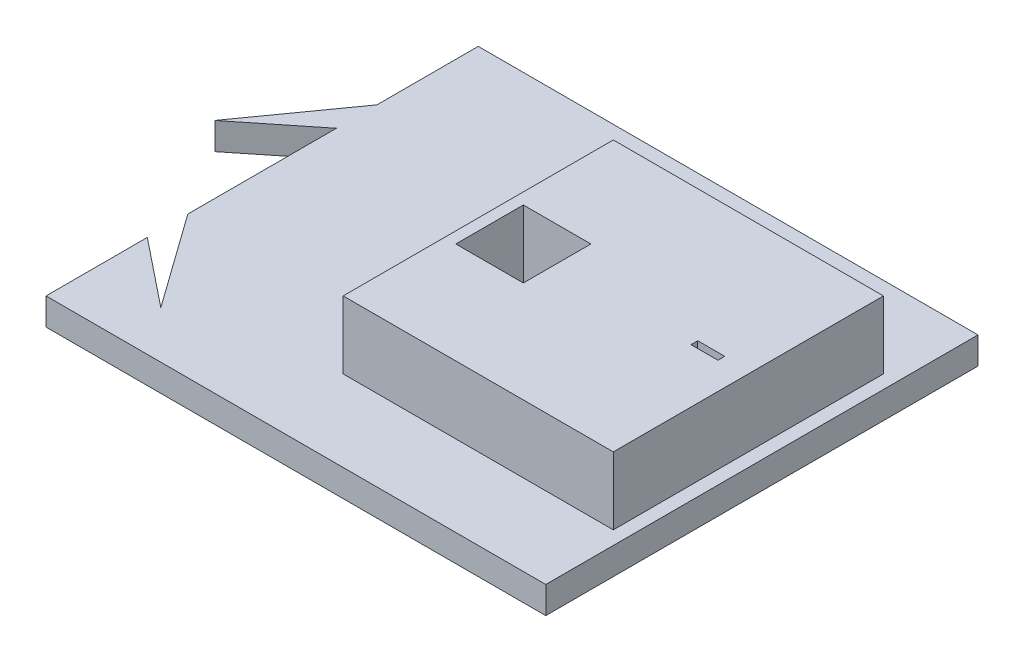
ISO-10303-21;
HEADER;
FILE_DESCRIPTION(('STEP AP214'),'2;1');
FILE_NAME('part.step','',(''),(''),'','','');
FILE_SCHEMA(('AUTOMOTIVE_DESIGN { 1 0 10303 214 1 1 1 1 }'));
ENDSEC;
DATA;
#1=APPLICATION_CONTEXT('core data for automotive mechanical design processes');
#2=APPLICATION_PROTOCOL_DEFINITION('international standard','automotive_design',2000,#1);
#3=PRODUCT_CONTEXT('',#1,'mechanical');
#4=PRODUCT('Part','Part','',(#3));
#5=PRODUCT_RELATED_PRODUCT_CATEGORY('part','',(#4));
#6=PRODUCT_DEFINITION_FORMATION('','',#4);
#7=PRODUCT_DEFINITION_CONTEXT('part definition',#1,'design');
#8=PRODUCT_DEFINITION('design','',#6,#7);
#9=PRODUCT_DEFINITION_SHAPE('','',#8);
#10=(LENGTH_UNIT() NAMED_UNIT(*) SI_UNIT(.MILLI.,.METRE.));
#11=(NAMED_UNIT(*) PLANE_ANGLE_UNIT() SI_UNIT($,.RADIAN.));
#12=(NAMED_UNIT(*) SI_UNIT($,.STERADIAN.) SOLID_ANGLE_UNIT());
#13=UNCERTAINTY_MEASURE_WITH_UNIT(LENGTH_MEASURE(1.E-05),#10,'distance_accuracy_value','');
#14=(GEOMETRIC_REPRESENTATION_CONTEXT(3) GLOBAL_UNCERTAINTY_ASSIGNED_CONTEXT((#13)) GLOBAL_UNIT_ASSIGNED_CONTEXT((#10,
#11,#12)) REPRESENTATION_CONTEXT('',''));
#15=CARTESIAN_POINT('',(0.,0.,0.));
#16=DIRECTION('',(0.,0.,1.));
#17=DIRECTION('',(1.,0.,0.));
#18=AXIS2_PLACEMENT_3D('',#15,#16,#17);
#19=CARTESIAN_POINT('',(0.,20.,0.));
#20=DIRECTION('',(0.,-1.,0.));
#21=DIRECTION('',(0.,0.,-1.));
#22=AXIS2_PLACEMENT_3D('',#19,#20,#21);
#23=PLANE('',#22);
#24=DIRECTION('',(0.,0.,1.));
#25=VECTOR('',#24,1.);
#26=CARTESIAN_POINT('',(0.,20.,0.));
#27=LINE('',#26,#25);
#28=CARTESIAN_POINT('',(0.,20.,-75.));
#29=VERTEX_POINT('',#28);
#30=CARTESIAN_POINT('',(0.,20.,0.));
#31=VERTEX_POINT('',#30);
#32=EDGE_CURVE('E274',#29,#31,#27,.T.);
#33=ORIENTED_EDGE('',*,*,#32,.T.);
#34=DIRECTION('',(1.,0.,0.));
#35=VECTOR('',#34,1.);
#36=CARTESIAN_POINT('',(0.,20.,0.));
#37=LINE('',#36,#35);
#38=CARTESIAN_POINT('',(370.,20.,0.));
#39=VERTEX_POINT('',#38);
#40=EDGE_CURVE('E277',#31,#39,#37,.T.);
#41=ORIENTED_EDGE('',*,*,#40,.T.);
#42=DIRECTION('',(0.,0.,-1.));
#43=VECTOR('',#42,1.);
#44=CARTESIAN_POINT('',(370.,20.,0.));
#45=LINE('',#44,#43);
#46=CARTESIAN_POINT('',(370.,20.,-320.));
#47=VERTEX_POINT('',#46);
#48=EDGE_CURVE('E280',#39,#47,#45,.T.);
#49=ORIENTED_EDGE('',*,*,#48,.T.);
#50=DIRECTION('',(-1.,0.,0.));
#51=VECTOR('',#50,1.);
#52=CARTESIAN_POINT('',(0.,20.,-320.));
#53=LINE('',#52,#51);
#54=CARTESIAN_POINT('',(0.,20.,-320.));
#55=VERTEX_POINT('',#54);
#56=EDGE_CURVE('E282',#47,#55,#53,.T.);
#57=ORIENTED_EDGE('',*,*,#56,.T.);
#58=DIRECTION('',(0.,0.,1.));
#59=VECTOR('',#58,1.);
#60=CARTESIAN_POINT('',(0.,20.,-245.));
#61=LINE('',#60,#59);
#62=CARTESIAN_POINT('',(0.,20.,-245.));
#63=VERTEX_POINT('',#62);
#64=EDGE_CURVE('E284',#55,#63,#61,.T.);
#65=ORIENTED_EDGE('',*,*,#64,.T.);
#66=DIRECTION('',(-0.581238193719096,0.,0.813733471206735));
#67=VECTOR('',#66,1.);
#68=CARTESIAN_POINT('',(-50.,20.,-175.));
#69=LINE('',#68,#67);
#70=CARTESIAN_POINT('',(-50.,20.,-175.));
#71=VERTEX_POINT('',#70);
#72=EDGE_CURVE('E286',#63,#71,#69,.T.);
#73=ORIENTED_EDGE('',*,*,#72,.T.);
#74=DIRECTION('',(0.78086880944303,0.,-0.624695047554424));
#75=VECTOR('',#74,1.);
#76=CARTESIAN_POINT('',(0.,20.,-215.));
#77=LINE('',#76,#75);
#78=CARTESIAN_POINT('',(0.,20.,-215.));
#79=VERTEX_POINT('',#78);
#80=EDGE_CURVE('E288',#71,#79,#77,.T.);
#81=ORIENTED_EDGE('',*,*,#80,.T.);
#82=DIRECTION('',(0.,0.,1.));
#83=VECTOR('',#82,1.);
#84=CARTESIAN_POINT('',(0.,20.,-105.));
#85=LINE('',#84,#83);
#86=CARTESIAN_POINT('',(0.,20.,-105.));
#87=VERTEX_POINT('',#86);
#88=EDGE_CURVE('E290',#79,#87,#85,.T.);
#89=ORIENTED_EDGE('',*,*,#88,.T.);
#90=DIRECTION('',(0.581238193719096,0.,0.813733471206735));
#91=VECTOR('',#90,1.);
#92=CARTESIAN_POINT('',(50.,20.,-35.));
#93=LINE('',#92,#91);
#94=CARTESIAN_POINT('',(50.,20.,-35.));
#95=VERTEX_POINT('',#94);
#96=EDGE_CURVE('E292',#87,#95,#93,.T.);
#97=ORIENTED_EDGE('',*,*,#96,.T.);
#98=DIRECTION('',(-0.78086880944303,0.,-0.624695047554424));
#99=VECTOR('',#98,1.);
#100=CARTESIAN_POINT('',(0.,20.,-75.));
#101=LINE('',#100,#99);
#102=EDGE_CURVE('E294',#95,#29,#101,.T.);
#103=ORIENTED_EDGE('',*,*,#102,.T.);
#104=EDGE_LOOP('',(#33,#41,#49,#57,#65,#73,#81,#89,#97,#103));
#105=FACE_BOUND('',#104,.T.);
#106=DIRECTION('',(0.,0.,-1.));
#107=VECTOR('',#106,1.);
#108=CARTESIAN_POINT('',(360.,20.,-60.));
#109=LINE('',#108,#107);
#110=CARTESIAN_POINT('',(360.,20.,-60.));
#111=VERTEX_POINT('',#110);
#112=CARTESIAN_POINT('',(360.,20.,-260.));
#113=VERTEX_POINT('',#112);
#114=EDGE_CURVE('E56',#111,#113,#109,.T.);
#115=ORIENTED_EDGE('',*,*,#114,.F.);
#116=DIRECTION('',(1.,0.,0.));
#117=VECTOR('',#116,1.);
#118=CARTESIAN_POINT('',(360.,20.,-60.));
#119=LINE('',#118,#117);
#120=CARTESIAN_POINT('',(160.,20.,-60.));
#121=VERTEX_POINT('',#120);
#122=EDGE_CURVE('E243',#121,#111,#119,.T.);
#123=ORIENTED_EDGE('',*,*,#122,.F.);
#124=DIRECTION('',(0.,0.,1.));
#125=VECTOR('',#124,1.);
#126=CARTESIAN_POINT('',(160.,20.,-60.));
#127=LINE('',#126,#125);
#128=CARTESIAN_POINT('',(160.,20.,-260.));
#129=VERTEX_POINT('',#128);
#130=EDGE_CURVE('E254',#129,#121,#127,.T.);
#131=ORIENTED_EDGE('',*,*,#130,.F.);
#132=DIRECTION('',(-1.,0.,0.));
#133=VECTOR('',#132,1.);
#134=CARTESIAN_POINT('',(360.,20.,-260.));
#135=LINE('',#134,#133);
#136=EDGE_CURVE('E251',#113,#129,#135,.T.);
#137=ORIENTED_EDGE('',*,*,#136,.F.);
#138=EDGE_LOOP('',(#115,#123,#131,#137));
#139=FACE_BOUND('',#138,.T.);
#140=ADVANCED_FACE('F33',(#105,#139),#23,.F.);
#141=CARTESIAN_POINT('',(0.,20.,0.));
#142=DIRECTION('',(1.,0.,0.));
#143=DIRECTION('',(0.,0.,-1.));
#144=AXIS2_PLACEMENT_3D('',#141,#142,#143);
#145=PLANE('',#144);
#146=DIRECTION('',(0.,0.,1.));
#147=VECTOR('',#146,1.);
#148=CARTESIAN_POINT('',(0.,0.,0.));
#149=LINE('',#148,#147);
#150=CARTESIAN_POINT('',(0.,0.,-75.));
#151=VERTEX_POINT('',#150);
#152=CARTESIAN_POINT('',(0.,0.,0.));
#153=VERTEX_POINT('',#152);
#154=EDGE_CURVE('E270',#151,#153,#149,.T.);
#155=ORIENTED_EDGE('',*,*,#154,.T.);
#156=DIRECTION('',(0.,-1.,0.));
#157=VECTOR('',#156,1.);
#158=CARTESIAN_POINT('',(0.,20.,0.));
#159=LINE('',#158,#157);
#160=EDGE_CURVE('E342',#31,#153,#159,.T.);
#161=ORIENTED_EDGE('',*,*,#160,.F.);
#162=ORIENTED_EDGE('',*,*,#32,.F.);
#163=DIRECTION('',(0.,-1.,0.));
#164=VECTOR('',#163,1.);
#165=CARTESIAN_POINT('',(0.,20.,-75.));
#166=LINE('',#165,#164);
#167=EDGE_CURVE('E296',#29,#151,#166,.T.);
#168=ORIENTED_EDGE('',*,*,#167,.T.);
#169=EDGE_LOOP('',(#155,#161,#162,#168));
#170=FACE_BOUND('',#169,.T.);
#171=ADVANCED_FACE('F35',(#170),#145,.F.);
#172=CARTESIAN_POINT('',(0.,20.,0.));
#173=DIRECTION('',(0.,0.,-1.));
#174=DIRECTION('',(-1.,0.,0.));
#175=AXIS2_PLACEMENT_3D('',#172,#173,#174);
#176=PLANE('',#175);
#177=DIRECTION('',(1.,0.,0.));
#178=VECTOR('',#177,1.);
#179=CARTESIAN_POINT('',(0.,0.,0.));
#180=LINE('',#179,#178);
#181=CARTESIAN_POINT('',(370.,0.,0.));
#182=VERTEX_POINT('',#181);
#183=EDGE_CURVE('E299',#153,#182,#180,.T.);
#184=ORIENTED_EDGE('',*,*,#183,.T.);
#185=DIRECTION('',(0.,-1.,0.));
#186=VECTOR('',#185,1.);
#187=CARTESIAN_POINT('',(370.,20.,0.));
#188=LINE('',#187,#186);
#189=EDGE_CURVE('E339',#39,#182,#188,.T.);
#190=ORIENTED_EDGE('',*,*,#189,.F.);
#191=ORIENTED_EDGE('',*,*,#40,.F.);
#192=ORIENTED_EDGE('',*,*,#160,.T.);
#193=EDGE_LOOP('',(#184,#190,#191,#192));
#194=FACE_BOUND('',#193,.T.);
#195=ADVANCED_FACE('F375',(#194),#176,.F.);
#196=CARTESIAN_POINT('',(370.,20.,0.));
#197=DIRECTION('',(-1.,0.,0.));
#198=DIRECTION('',(0.,0.,1.));
#199=AXIS2_PLACEMENT_3D('',#196,#197,#198);
#200=PLANE('',#199);
#201=DIRECTION('',(0.,0.,-1.));
#202=VECTOR('',#201,1.);
#203=CARTESIAN_POINT('',(370.,0.,0.));
#204=LINE('',#203,#202);
#205=CARTESIAN_POINT('',(370.,0.,-320.));
#206=VERTEX_POINT('',#205);
#207=EDGE_CURVE('E301',#182,#206,#204,.T.);
#208=ORIENTED_EDGE('',*,*,#207,.T.);
#209=DIRECTION('',(0.,-1.,0.));
#210=VECTOR('',#209,1.);
#211=CARTESIAN_POINT('',(370.,20.,-320.));
#212=LINE('',#211,#210);
#213=EDGE_CURVE('E336',#47,#206,#212,.T.);
#214=ORIENTED_EDGE('',*,*,#213,.F.);
#215=ORIENTED_EDGE('',*,*,#48,.F.);
#216=ORIENTED_EDGE('',*,*,#189,.T.);
#217=EDGE_LOOP('',(#208,#214,#215,#216));
#218=FACE_BOUND('',#217,.T.);
#219=ADVANCED_FACE('F462',(#218),#200,.F.);
#220=CARTESIAN_POINT('',(0.,20.,-320.));
#221=DIRECTION('',(0.,0.,1.));
#222=DIRECTION('',(1.,0.,0.));
#223=AXIS2_PLACEMENT_3D('',#220,#221,#222);
#224=PLANE('',#223);
#225=DIRECTION('',(-1.,0.,0.));
#226=VECTOR('',#225,1.);
#227=CARTESIAN_POINT('',(0.,0.,-320.));
#228=LINE('',#227,#226);
#229=CARTESIAN_POINT('',(0.,0.,-320.));
#230=VERTEX_POINT('',#229);
#231=EDGE_CURVE('E303',#206,#230,#228,.T.);
#232=ORIENTED_EDGE('',*,*,#231,.T.);
#233=DIRECTION('',(0.,-1.,0.));
#234=VECTOR('',#233,1.);
#235=CARTESIAN_POINT('',(0.,20.,-320.));
#236=LINE('',#235,#234);
#237=EDGE_CURVE('E333',#55,#230,#236,.T.);
#238=ORIENTED_EDGE('',*,*,#237,.F.);
#239=ORIENTED_EDGE('',*,*,#56,.F.);
#240=ORIENTED_EDGE('',*,*,#213,.T.);
#241=EDGE_LOOP('',(#232,#238,#239,#240));
#242=FACE_BOUND('',#241,.T.);
#243=ADVANCED_FACE('F458',(#242),#224,.F.);
#244=CARTESIAN_POINT('',(0.,20.,-245.));
#245=DIRECTION('',(1.,0.,0.));
#246=DIRECTION('',(0.,0.,-1.));
#247=AXIS2_PLACEMENT_3D('',#244,#245,#246);
#248=PLANE('',#247);
#249=DIRECTION('',(0.,0.,1.));
#250=VECTOR('',#249,1.);
#251=CARTESIAN_POINT('',(0.,0.,-245.));
#252=LINE('',#251,#250);
#253=CARTESIAN_POINT('',(0.,0.,-245.));
#254=VERTEX_POINT('',#253);
#255=EDGE_CURVE('E305',#230,#254,#252,.T.);
#256=ORIENTED_EDGE('',*,*,#255,.T.);
#257=DIRECTION('',(0.,-1.,0.));
#258=VECTOR('',#257,1.);
#259=CARTESIAN_POINT('',(0.,20.,-245.));
#260=LINE('',#259,#258);
#261=EDGE_CURVE('E330',#63,#254,#260,.T.);
#262=ORIENTED_EDGE('',*,*,#261,.F.);
#263=ORIENTED_EDGE('',*,*,#64,.F.);
#264=ORIENTED_EDGE('',*,*,#237,.T.);
#265=EDGE_LOOP('',(#256,#262,#263,#264));
#266=FACE_BOUND('',#265,.T.);
#267=ADVANCED_FACE('F454',(#266),#248,.F.);
#268=CARTESIAN_POINT('',(-50.,20.,-175.));
#269=DIRECTION('',(0.813733471206735,0.,0.581238193719096));
#270=DIRECTION('',(0.581238193719096,0.,-0.813733471206735));
#271=AXIS2_PLACEMENT_3D('',#268,#269,#270);
#272=PLANE('',#271);
#273=DIRECTION('',(-0.581238193719096,0.,0.813733471206735));
#274=VECTOR('',#273,1.);
#275=CARTESIAN_POINT('',(-50.,0.,-175.));
#276=LINE('',#275,#274);
#277=CARTESIAN_POINT('',(-50.,0.,-175.));
#278=VERTEX_POINT('',#277);
#279=EDGE_CURVE('E307',#254,#278,#276,.T.);
#280=ORIENTED_EDGE('',*,*,#279,.T.);
#281=DIRECTION('',(0.,-1.,0.));
#282=VECTOR('',#281,1.);
#283=CARTESIAN_POINT('',(-50.,20.,-175.));
#284=LINE('',#283,#282);
#285=EDGE_CURVE('E327',#71,#278,#284,.T.);
#286=ORIENTED_EDGE('',*,*,#285,.F.);
#287=ORIENTED_EDGE('',*,*,#72,.F.);
#288=ORIENTED_EDGE('',*,*,#261,.T.);
#289=EDGE_LOOP('',(#280,#286,#287,#288));
#290=FACE_BOUND('',#289,.T.);
#291=ADVANCED_FACE('F450',(#290),#272,.F.);
#292=CARTESIAN_POINT('',(0.,20.,-215.));
#293=DIRECTION('',(-0.624695047554424,0.,-0.78086880944303));
#294=DIRECTION('',(-0.78086880944303,0.,0.624695047554424));
#295=AXIS2_PLACEMENT_3D('',#292,#293,#294);
#296=PLANE('',#295);
#297=DIRECTION('',(0.78086880944303,0.,-0.624695047554424));
#298=VECTOR('',#297,1.);
#299=CARTESIAN_POINT('',(0.,0.,-215.));
#300=LINE('',#299,#298);
#301=CARTESIAN_POINT('',(0.,0.,-215.));
#302=VERTEX_POINT('',#301);
#303=EDGE_CURVE('E309',#278,#302,#300,.T.);
#304=ORIENTED_EDGE('',*,*,#303,.T.);
#305=DIRECTION('',(0.,-1.,0.));
#306=VECTOR('',#305,1.);
#307=CARTESIAN_POINT('',(0.,20.,-215.));
#308=LINE('',#307,#306);
#309=EDGE_CURVE('E324',#79,#302,#308,.T.);
#310=ORIENTED_EDGE('',*,*,#309,.F.);
#311=ORIENTED_EDGE('',*,*,#80,.F.);
#312=ORIENTED_EDGE('',*,*,#285,.T.);
#313=EDGE_LOOP('',(#304,#310,#311,#312));
#314=FACE_BOUND('',#313,.T.);
#315=ADVANCED_FACE('F446',(#314),#296,.F.);
#316=CARTESIAN_POINT('',(0.,20.,-105.));
#317=DIRECTION('',(1.,0.,0.));
#318=DIRECTION('',(0.,0.,-1.));
#319=AXIS2_PLACEMENT_3D('',#316,#317,#318);
#320=PLANE('',#319);
#321=DIRECTION('',(0.,0.,1.));
#322=VECTOR('',#321,1.);
#323=CARTESIAN_POINT('',(0.,0.,-105.));
#324=LINE('',#323,#322);
#325=CARTESIAN_POINT('',(0.,0.,-105.));
#326=VERTEX_POINT('',#325);
#327=EDGE_CURVE('E311',#302,#326,#324,.T.);
#328=ORIENTED_EDGE('',*,*,#327,.T.);
#329=DIRECTION('',(0.,-1.,0.));
#330=VECTOR('',#329,1.);
#331=CARTESIAN_POINT('',(0.,20.,-105.));
#332=LINE('',#331,#330);
#333=EDGE_CURVE('E321',#87,#326,#332,.T.);
#334=ORIENTED_EDGE('',*,*,#333,.F.);
#335=ORIENTED_EDGE('',*,*,#88,.F.);
#336=ORIENTED_EDGE('',*,*,#309,.T.);
#337=EDGE_LOOP('',(#328,#334,#335,#336));
#338=FACE_BOUND('',#337,.T.);
#339=ADVANCED_FACE('F442',(#338),#320,.F.);
#340=CARTESIAN_POINT('',(50.,20.,-35.));
#341=DIRECTION('',(0.813733471206735,0.,-0.581238193719096));
#342=DIRECTION('',(-0.581238193719096,0.,-0.813733471206735));
#343=AXIS2_PLACEMENT_3D('',#340,#341,#342);
#344=PLANE('',#343);
#345=DIRECTION('',(0.581238193719096,0.,0.813733471206735));
#346=VECTOR('',#345,1.);
#347=CARTESIAN_POINT('',(50.,0.,-35.));
#348=LINE('',#347,#346);
#349=CARTESIAN_POINT('',(50.,0.,-35.));
#350=VERTEX_POINT('',#349);
#351=EDGE_CURVE('E313',#326,#350,#348,.T.);
#352=ORIENTED_EDGE('',*,*,#351,.T.);
#353=DIRECTION('',(0.,-1.,0.));
#354=VECTOR('',#353,1.);
#355=CARTESIAN_POINT('',(50.,20.,-35.));
#356=LINE('',#355,#354);
#357=EDGE_CURVE('E318',#95,#350,#356,.T.);
#358=ORIENTED_EDGE('',*,*,#357,.F.);
#359=ORIENTED_EDGE('',*,*,#96,.F.);
#360=ORIENTED_EDGE('',*,*,#333,.T.);
#361=EDGE_LOOP('',(#352,#358,#359,#360));
#362=FACE_BOUND('',#361,.T.);
#363=ADVANCED_FACE('F436',(#362),#344,.F.);
#364=CARTESIAN_POINT('',(0.,20.,-75.));
#365=DIRECTION('',(-0.624695047554424,0.,0.78086880944303));
#366=DIRECTION('',(0.78086880944303,0.,0.624695047554424));
#367=AXIS2_PLACEMENT_3D('',#364,#365,#366);
#368=PLANE('',#367);
#369=DIRECTION('',(-0.78086880944303,0.,-0.624695047554424));
#370=VECTOR('',#369,1.);
#371=CARTESIAN_POINT('',(0.,0.,-75.));
#372=LINE('',#371,#370);
#373=EDGE_CURVE('E278',#350,#151,#372,.T.);
#374=ORIENTED_EDGE('',*,*,#373,.T.);
#375=ORIENTED_EDGE('',*,*,#167,.F.);
#376=ORIENTED_EDGE('',*,*,#102,.F.);
#377=ORIENTED_EDGE('',*,*,#357,.T.);
#378=EDGE_LOOP('',(#374,#375,#376,#377));
#379=FACE_BOUND('',#378,.T.);
#380=ADVANCED_FACE('F432',(#379),#368,.F.);
#381=CARTESIAN_POINT('',(0.,0.,0.));
#382=DIRECTION('',(0.,-1.,0.));
#383=DIRECTION('',(0.,0.,-1.));
#384=AXIS2_PLACEMENT_3D('',#381,#382,#383);
#385=PLANE('',#384);
#386=DIRECTION('',(0.,0.,1.));
#387=VECTOR('',#386,1.);
#388=CARTESIAN_POINT('',(340.,0.,0.));
#389=LINE('',#388,#387);
#390=CARTESIAN_POINT('',(340.,0.,-162.5));
#391=VERTEX_POINT('',#390);
#392=CARTESIAN_POINT('',(340.,0.,-157.5));
#393=VERTEX_POINT('',#392);
#394=EDGE_CURVE('E11',#391,#393,#389,.T.);
#395=ORIENTED_EDGE('',*,*,#394,.F.);
#396=DIRECTION('',(1.,0.,0.));
#397=VECTOR('',#396,1.);
#398=CARTESIAN_POINT('',(-2.25514051876984E-13,0.,-162.5));
#399=LINE('',#398,#397);
#400=CARTESIAN_POINT('',(320.,0.,-162.5));
#401=VERTEX_POINT('',#400);
#402=EDGE_CURVE('E41',#401,#391,#399,.T.);
#403=ORIENTED_EDGE('',*,*,#402,.F.);
#404=DIRECTION('',(0.,0.,-1.));
#405=VECTOR('',#404,1.);
#406=CARTESIAN_POINT('',(320.,0.,0.));
#407=LINE('',#406,#405);
#408=CARTESIAN_POINT('',(320.,0.,-157.5));
#409=VERTEX_POINT('',#408);
#410=EDGE_CURVE('E190',#409,#401,#407,.T.);
#411=ORIENTED_EDGE('',*,*,#410,.F.);
#412=DIRECTION('',(-1.,0.,0.));
#413=VECTOR('',#412,1.);
#414=CARTESIAN_POINT('',(0.,0.,-157.5));
#415=LINE('',#414,#413);
#416=EDGE_CURVE('E345',#393,#409,#415,.T.);
#417=ORIENTED_EDGE('',*,*,#416,.F.);
#418=EDGE_LOOP('',(#395,#403,#411,#417));
#419=FACE_BOUND('',#418,.T.);
#420=ORIENTED_EDGE('',*,*,#154,.F.);
#421=ORIENTED_EDGE('',*,*,#373,.F.);
#422=ORIENTED_EDGE('',*,*,#351,.F.);
#423=ORIENTED_EDGE('',*,*,#327,.F.);
#424=ORIENTED_EDGE('',*,*,#303,.F.);
#425=ORIENTED_EDGE('',*,*,#279,.F.);
#426=ORIENTED_EDGE('',*,*,#255,.F.);
#427=ORIENTED_EDGE('',*,*,#231,.F.);
#428=ORIENTED_EDGE('',*,*,#207,.F.);
#429=ORIENTED_EDGE('',*,*,#183,.F.);
#430=EDGE_LOOP('',(#420,#421,#422,#423,#424,#425,#426,#427,#428,#429));
#431=FACE_BOUND('',#430,.T.);
#432=ADVANCED_FACE('F352',(#419,#431),#385,.T.);
#433=CARTESIAN_POINT('',(340.,20.,-162.5));
#434=DIRECTION('',(1.,0.,0.));
#435=DIRECTION('',(0.,0.,-1.));
#436=AXIS2_PLACEMENT_3D('',#433,#434,#435);
#437=PLANE('',#436);
#438=ORIENTED_EDGE('',*,*,#394,.T.);
#439=DIRECTION('',(0.,-1.,0.));
#440=VECTOR('',#439,1.);
#441=CARTESIAN_POINT('',(340.,20.,-157.5));
#442=LINE('',#441,#440);
#443=CARTESIAN_POINT('',(340.,70.,-157.5));
#444=VERTEX_POINT('',#443);
#445=EDGE_CURVE('E269',#444,#393,#442,.T.);
#446=ORIENTED_EDGE('',*,*,#445,.F.);
#447=DIRECTION('',(0.,0.,1.));
#448=VECTOR('',#447,1.);
#449=CARTESIAN_POINT('',(340.,70.,-157.5));
#450=LINE('',#449,#448);
#451=CARTESIAN_POINT('',(340.,70.,-162.5));
#452=VERTEX_POINT('',#451);
#453=EDGE_CURVE('E199',#452,#444,#450,.T.);
#454=ORIENTED_EDGE('',*,*,#453,.F.);
#455=DIRECTION('',(0.,-1.,0.));
#456=VECTOR('',#455,1.);
#457=CARTESIAN_POINT('',(340.,20.,-162.5));
#458=LINE('',#457,#456);
#459=EDGE_CURVE('E48',#452,#391,#458,.T.);
#460=ORIENTED_EDGE('',*,*,#459,.T.);
#461=EDGE_LOOP('',(#438,#446,#454,#460));
#462=FACE_BOUND('',#461,.T.);
#463=ADVANCED_FACE('F350',(#462),#437,.F.);
#464=CARTESIAN_POINT('',(340.,20.,-162.5));
#465=DIRECTION('',(0.,0.,-1.));
#466=DIRECTION('',(-1.,0.,0.));
#467=AXIS2_PLACEMENT_3D('',#464,#465,#466);
#468=PLANE('',#467);
#469=ORIENTED_EDGE('',*,*,#402,.T.);
#470=ORIENTED_EDGE('',*,*,#459,.F.);
#471=DIRECTION('',(1.,0.,0.));
#472=VECTOR('',#471,1.);
#473=CARTESIAN_POINT('',(320.,70.,-162.5));
#474=LINE('',#473,#472);
#475=CARTESIAN_POINT('',(320.,70.,-162.5));
#476=VERTEX_POINT('',#475);
#477=EDGE_CURVE('E195',#476,#452,#474,.T.);
#478=ORIENTED_EDGE('',*,*,#477,.F.);
#479=DIRECTION('',(0.,-1.,0.));
#480=VECTOR('',#479,1.);
#481=CARTESIAN_POINT('',(320.,20.,-162.5));
#482=LINE('',#481,#480);
#483=EDGE_CURVE('E183',#476,#401,#482,.T.);
#484=ORIENTED_EDGE('',*,*,#483,.T.);
#485=EDGE_LOOP('',(#469,#470,#478,#484));
#486=FACE_BOUND('',#485,.T.);
#487=ADVANCED_FACE('F196',(#486),#468,.F.);
#488=CARTESIAN_POINT('',(320.,20.,-162.5));
#489=DIRECTION('',(-1.,0.,0.));
#490=DIRECTION('',(0.,0.,1.));
#491=AXIS2_PLACEMENT_3D('',#488,#489,#490);
#492=PLANE('',#491);
#493=ORIENTED_EDGE('',*,*,#410,.T.);
#494=ORIENTED_EDGE('',*,*,#483,.F.);
#495=DIRECTION('',(0.,0.,-1.));
#496=VECTOR('',#495,1.);
#497=CARTESIAN_POINT('',(320.,70.,-157.5));
#498=LINE('',#497,#496);
#499=CARTESIAN_POINT('',(320.,70.,-157.5));
#500=VERTEX_POINT('',#499);
#501=EDGE_CURVE('E187',#500,#476,#498,.T.);
#502=ORIENTED_EDGE('',*,*,#501,.F.);
#503=DIRECTION('',(0.,-1.,0.));
#504=VECTOR('',#503,1.);
#505=CARTESIAN_POINT('',(320.,20.,-157.5));
#506=LINE('',#505,#504);
#507=EDGE_CURVE('E192',#500,#409,#506,.T.);
#508=ORIENTED_EDGE('',*,*,#507,.T.);
#509=EDGE_LOOP('',(#493,#494,#502,#508));
#510=FACE_BOUND('',#509,.T.);
#511=ADVANCED_FACE('F184',(#510),#492,.F.);
#512=CARTESIAN_POINT('',(340.,20.,-157.5));
#513=DIRECTION('',(0.,0.,1.));
#514=DIRECTION('',(1.,0.,0.));
#515=AXIS2_PLACEMENT_3D('',#512,#513,#514);
#516=PLANE('',#515);
#517=ORIENTED_EDGE('',*,*,#416,.T.);
#518=ORIENTED_EDGE('',*,*,#507,.F.);
#519=DIRECTION('',(-1.,0.,0.));
#520=VECTOR('',#519,1.);
#521=CARTESIAN_POINT('',(320.,70.,-157.5));
#522=LINE('',#521,#520);
#523=EDGE_CURVE('E204',#444,#500,#522,.T.);
#524=ORIENTED_EDGE('',*,*,#523,.F.);
#525=ORIENTED_EDGE('',*,*,#445,.T.);
#526=EDGE_LOOP('',(#517,#518,#524,#525));
#527=FACE_BOUND('',#526,.T.);
#528=ADVANCED_FACE('F355',(#527),#516,.F.);
#529=CARTESIAN_POINT('',(218.4,70.,-135.));
#530=DIRECTION('',(0.,0.,-1.));
#531=DIRECTION('',(-1.,0.,0.));
#532=AXIS2_PLACEMENT_3D('',#529,#530,#531);
#533=PLANE('',#532);
#534=DIRECTION('',(1.,0.,0.));
#535=VECTOR('',#534,1.);
#536=CARTESIAN_POINT('',(218.4,20.,-135.));
#537=LINE('',#536,#535);
#538=CARTESIAN_POINT('',(168.4,20.,-135.));
#539=VERTEX_POINT('',#538);
#540=CARTESIAN_POINT('',(218.4,20.,-135.));
#541=VERTEX_POINT('',#540);
#542=EDGE_CURVE('E213',#539,#541,#537,.T.);
#543=ORIENTED_EDGE('',*,*,#542,.F.);
#544=DIRECTION('',(0.,-1.,0.));
#545=VECTOR('',#544,1.);
#546=CARTESIAN_POINT('',(168.4,70.,-135.));
#547=LINE('',#546,#545);
#548=CARTESIAN_POINT('',(168.4,70.,-135.));
#549=VERTEX_POINT('',#548);
#550=EDGE_CURVE('E232',#549,#539,#547,.T.);
#551=ORIENTED_EDGE('',*,*,#550,.F.);
#552=DIRECTION('',(1.,0.,0.));
#553=VECTOR('',#552,1.);
#554=CARTESIAN_POINT('',(218.4,70.,-135.));
#555=LINE('',#554,#553);
#556=CARTESIAN_POINT('',(218.4,70.,-135.));
#557=VERTEX_POINT('',#556);
#558=EDGE_CURVE('E218',#549,#557,#555,.T.);
#559=ORIENTED_EDGE('',*,*,#558,.T.);
#560=DIRECTION('',(0.,-1.,0.));
#561=VECTOR('',#560,1.);
#562=CARTESIAN_POINT('',(218.4,70.,-135.));
#563=LINE('',#562,#561);
#564=EDGE_CURVE('E220',#557,#541,#563,.T.);
#565=ORIENTED_EDGE('',*,*,#564,.T.);
#566=EDGE_LOOP('',(#543,#551,#559,#565));
#567=FACE_BOUND('',#566,.T.);
#568=ADVANCED_FACE('F357',(#567),#533,.T.);
#569=CARTESIAN_POINT('',(168.4,70.,-135.));
#570=DIRECTION('',(1.,0.,0.));
#571=DIRECTION('',(0.,0.,-1.));
#572=AXIS2_PLACEMENT_3D('',#569,#570,#571);
#573=PLANE('',#572);
#574=DIRECTION('',(0.,0.,1.));
#575=VECTOR('',#574,1.);
#576=CARTESIAN_POINT('',(168.4,20.,-135.));
#577=LINE('',#576,#575);
#578=CARTESIAN_POINT('',(168.4,20.,-185.));
#579=VERTEX_POINT('',#578);
#580=EDGE_CURVE('E226',#579,#539,#577,.T.);
#581=ORIENTED_EDGE('',*,*,#580,.F.);
#582=DIRECTION('',(0.,-1.,0.));
#583=VECTOR('',#582,1.);
#584=CARTESIAN_POINT('',(168.4,70.,-185.));
#585=LINE('',#584,#583);
#586=CARTESIAN_POINT('',(168.4,70.,-185.));
#587=VERTEX_POINT('',#586);
#588=EDGE_CURVE('E234',#587,#579,#585,.T.);
#589=ORIENTED_EDGE('',*,*,#588,.F.);
#590=DIRECTION('',(0.,0.,1.));
#591=VECTOR('',#590,1.);
#592=CARTESIAN_POINT('',(168.4,70.,-135.));
#593=LINE('',#592,#591);
#594=EDGE_CURVE('E215',#587,#549,#593,.T.);
#595=ORIENTED_EDGE('',*,*,#594,.T.);
#596=ORIENTED_EDGE('',*,*,#550,.T.);
#597=EDGE_LOOP('',(#581,#589,#595,#596));
#598=FACE_BOUND('',#597,.T.);
#599=ADVANCED_FACE('F363',(#598),#573,.T.);
#600=CARTESIAN_POINT('',(218.4,70.,-185.));
#601=DIRECTION('',(0.,0.,1.));
#602=DIRECTION('',(1.,0.,0.));
#603=AXIS2_PLACEMENT_3D('',#600,#601,#602);
#604=PLANE('',#603);
#605=DIRECTION('',(-1.,0.,0.));
#606=VECTOR('',#605,1.);
#607=CARTESIAN_POINT('',(218.4,20.,-185.));
#608=LINE('',#607,#606);
#609=CARTESIAN_POINT('',(218.4,20.,-185.));
#610=VERTEX_POINT('',#609);
#611=EDGE_CURVE('E223',#610,#579,#608,.T.);
#612=ORIENTED_EDGE('',*,*,#611,.F.);
#613=DIRECTION('',(0.,-1.,0.));
#614=VECTOR('',#613,1.);
#615=CARTESIAN_POINT('',(218.4,70.,-185.));
#616=LINE('',#615,#614);
#617=CARTESIAN_POINT('',(218.4,70.,-185.));
#618=VERTEX_POINT('',#617);
#619=EDGE_CURVE('E236',#618,#610,#616,.T.);
#620=ORIENTED_EDGE('',*,*,#619,.F.);
#621=DIRECTION('',(-1.,0.,0.));
#622=VECTOR('',#621,1.);
#623=CARTESIAN_POINT('',(218.4,70.,-185.));
#624=LINE('',#623,#622);
#625=EDGE_CURVE('E212',#618,#587,#624,.T.);
#626=ORIENTED_EDGE('',*,*,#625,.T.);
#627=ORIENTED_EDGE('',*,*,#588,.T.);
#628=EDGE_LOOP('',(#612,#620,#626,#627));
#629=FACE_BOUND('',#628,.T.);
#630=ADVANCED_FACE('F396',(#629),#604,.T.);
#631=CARTESIAN_POINT('',(218.4,70.,-135.));
#632=DIRECTION('',(-1.,0.,0.));
#633=DIRECTION('',(0.,0.,1.));
#634=AXIS2_PLACEMENT_3D('',#631,#632,#633);
#635=PLANE('',#634);
#636=DIRECTION('',(0.,0.,-1.));
#637=VECTOR('',#636,1.);
#638=CARTESIAN_POINT('',(218.4,20.,-135.));
#639=LINE('',#638,#637);
#640=EDGE_CURVE('E209',#541,#610,#639,.T.);
#641=ORIENTED_EDGE('',*,*,#640,.F.);
#642=ORIENTED_EDGE('',*,*,#564,.F.);
#643=DIRECTION('',(0.,0.,-1.));
#644=VECTOR('',#643,1.);
#645=CARTESIAN_POINT('',(218.4,70.,-135.));
#646=LINE('',#645,#644);
#647=EDGE_CURVE('E210',#557,#618,#646,.T.);
#648=ORIENTED_EDGE('',*,*,#647,.T.);
#649=ORIENTED_EDGE('',*,*,#619,.T.);
#650=EDGE_LOOP('',(#641,#642,#648,#649));
#651=FACE_BOUND('',#650,.T.);
#652=ADVANCED_FACE('F392',(#651),#635,.T.);
#653=CARTESIAN_POINT('',(360.,70.,-60.));
#654=DIRECTION('',(0.,0.,-1.));
#655=DIRECTION('',(-1.,0.,0.));
#656=AXIS2_PLACEMENT_3D('',#653,#654,#655);
#657=PLANE('',#656);
#658=ORIENTED_EDGE('',*,*,#122,.T.);
#659=DIRECTION('',(0.,-1.,0.));
#660=VECTOR('',#659,1.);
#661=CARTESIAN_POINT('',(360.,70.,-60.));
#662=LINE('',#661,#660);
#663=CARTESIAN_POINT('',(360.,70.,-60.));
#664=VERTEX_POINT('',#663);
#665=EDGE_CURVE('E249',#664,#111,#662,.T.);
#666=ORIENTED_EDGE('',*,*,#665,.F.);
#667=DIRECTION('',(1.,0.,0.));
#668=VECTOR('',#667,1.);
#669=CARTESIAN_POINT('',(360.,70.,-60.));
#670=LINE('',#669,#668);
#671=CARTESIAN_POINT('',(160.,70.,-60.));
#672=VERTEX_POINT('',#671);
#673=EDGE_CURVE('E247',#672,#664,#670,.T.);
#674=ORIENTED_EDGE('',*,*,#673,.F.);
#675=DIRECTION('',(0.,-1.,0.));
#676=VECTOR('',#675,1.);
#677=CARTESIAN_POINT('',(160.,70.,-60.));
#678=LINE('',#677,#676);
#679=EDGE_CURVE('E260',#672,#121,#678,.T.);
#680=ORIENTED_EDGE('',*,*,#679,.T.);
#681=EDGE_LOOP('',(#658,#666,#674,#680));
#682=FACE_BOUND('',#681,.T.);
#683=ADVANCED_FACE('F409',(#682),#657,.F.);
#684=CARTESIAN_POINT('',(160.,70.,-60.));
#685=DIRECTION('',(1.,0.,0.));
#686=DIRECTION('',(0.,0.,-1.));
#687=AXIS2_PLACEMENT_3D('',#684,#685,#686);
#688=PLANE('',#687);
#689=ORIENTED_EDGE('',*,*,#130,.T.);
#690=ORIENTED_EDGE('',*,*,#679,.F.);
#691=DIRECTION('',(0.,0.,1.));
#692=VECTOR('',#691,1.);
#693=CARTESIAN_POINT('',(160.,70.,-60.));
#694=LINE('',#693,#692);
#695=CARTESIAN_POINT('',(160.,70.,-260.));
#696=VERTEX_POINT('',#695);
#697=EDGE_CURVE('E245',#696,#672,#694,.T.);
#698=ORIENTED_EDGE('',*,*,#697,.F.);
#699=DIRECTION('',(0.,-1.,0.));
#700=VECTOR('',#699,1.);
#701=CARTESIAN_POINT('',(160.,70.,-260.));
#702=LINE('',#701,#700);
#703=EDGE_CURVE('E263',#696,#129,#702,.T.);
#704=ORIENTED_EDGE('',*,*,#703,.T.);
#705=EDGE_LOOP('',(#689,#690,#698,#704));
#706=FACE_BOUND('',#705,.T.);
#707=ADVANCED_FACE('F413',(#706),#688,.F.);
#708=CARTESIAN_POINT('',(360.,70.,-260.));
#709=DIRECTION('',(0.,0.,1.));
#710=DIRECTION('',(1.,0.,0.));
#711=AXIS2_PLACEMENT_3D('',#708,#709,#710);
#712=PLANE('',#711);
#713=ORIENTED_EDGE('',*,*,#136,.T.);
#714=ORIENTED_EDGE('',*,*,#703,.F.);
#715=DIRECTION('',(-1.,0.,0.));
#716=VECTOR('',#715,1.);
#717=CARTESIAN_POINT('',(360.,70.,-260.));
#718=LINE('',#717,#716);
#719=CARTESIAN_POINT('',(360.,70.,-260.));
#720=VERTEX_POINT('',#719);
#721=EDGE_CURVE('E242',#720,#696,#718,.T.);
#722=ORIENTED_EDGE('',*,*,#721,.F.);
#723=DIRECTION('',(0.,-1.,0.));
#724=VECTOR('',#723,1.);
#725=CARTESIAN_POINT('',(360.,70.,-260.));
#726=LINE('',#725,#724);
#727=EDGE_CURVE('E266',#720,#113,#726,.T.);
#728=ORIENTED_EDGE('',*,*,#727,.T.);
#729=EDGE_LOOP('',(#713,#714,#722,#728));
#730=FACE_BOUND('',#729,.T.);
#731=ADVANCED_FACE('F417',(#730),#712,.F.);
#732=CARTESIAN_POINT('',(360.,70.,-60.));
#733=DIRECTION('',(-1.,0.,0.));
#734=DIRECTION('',(0.,0.,1.));
#735=AXIS2_PLACEMENT_3D('',#732,#733,#734);
#736=PLANE('',#735);
#737=ORIENTED_EDGE('',*,*,#114,.T.);
#738=ORIENTED_EDGE('',*,*,#727,.F.);
#739=DIRECTION('',(0.,0.,-1.));
#740=VECTOR('',#739,1.);
#741=CARTESIAN_POINT('',(360.,70.,-60.));
#742=LINE('',#741,#740);
#743=EDGE_CURVE('E239',#664,#720,#742,.T.);
#744=ORIENTED_EDGE('',*,*,#743,.F.);
#745=ORIENTED_EDGE('',*,*,#665,.T.);
#746=EDGE_LOOP('',(#737,#738,#744,#745));
#747=FACE_BOUND('',#746,.T.);
#748=ADVANCED_FACE('F383',(#747),#736,.F.);
#749=CARTESIAN_POINT('',(0.,70.,0.));
#750=DIRECTION('',(0.,1.,0.));
#751=DIRECTION('',(0.,0.,1.));
#752=AXIS2_PLACEMENT_3D('',#749,#750,#751);
#753=PLANE('',#752);
#754=ORIENTED_EDGE('',*,*,#501,.T.);
#755=ORIENTED_EDGE('',*,*,#477,.T.);
#756=ORIENTED_EDGE('',*,*,#453,.T.);
#757=ORIENTED_EDGE('',*,*,#523,.T.);
#758=EDGE_LOOP('',(#754,#755,#756,#757));
#759=FACE_BOUND('',#758,.T.);
#760=ORIENTED_EDGE('',*,*,#743,.T.);
#761=ORIENTED_EDGE('',*,*,#721,.T.);
#762=ORIENTED_EDGE('',*,*,#697,.T.);
#763=ORIENTED_EDGE('',*,*,#673,.T.);
#764=EDGE_LOOP('',(#760,#761,#762,#763));
#765=FACE_BOUND('',#764,.T.);
#766=ORIENTED_EDGE('',*,*,#625,.F.);
#767=ORIENTED_EDGE('',*,*,#647,.F.);
#768=ORIENTED_EDGE('',*,*,#558,.F.);
#769=ORIENTED_EDGE('',*,*,#594,.F.);
#770=EDGE_LOOP('',(#766,#767,#768,#769));
#771=FACE_BOUND('',#770,.T.);
#772=ADVANCED_FACE('F201',(#759,#765,#771),#753,.T.);
#773=ORIENTED_EDGE('',*,*,#542,.T.);
#774=ORIENTED_EDGE('',*,*,#640,.T.);
#775=ORIENTED_EDGE('',*,*,#611,.T.);
#776=ORIENTED_EDGE('',*,*,#580,.T.);
#777=EDGE_LOOP('',(#773,#774,#775,#776));
#778=FACE_BOUND('',#777,.T.);
#779=ADVANCED_FACE('F371',(#778),#23,.F.);
#780=CLOSED_SHELL('',(#140,#171,#195,#219,#243,#267,#291,#315,#339,#363,#380,#432,#463,#487,
#511,#528,#568,#599,#630,#652,#683,#707,#731,#748,#772,#779));
#781=MANIFOLD_SOLID_BREP('B2',#780);
#782=ADVANCED_BREP_SHAPE_REPRESENTATION('',(#18,#781),#14);
#783=SHAPE_DEFINITION_REPRESENTATION(#9,#782);
ENDSEC;
END-ISO-10303-21;
